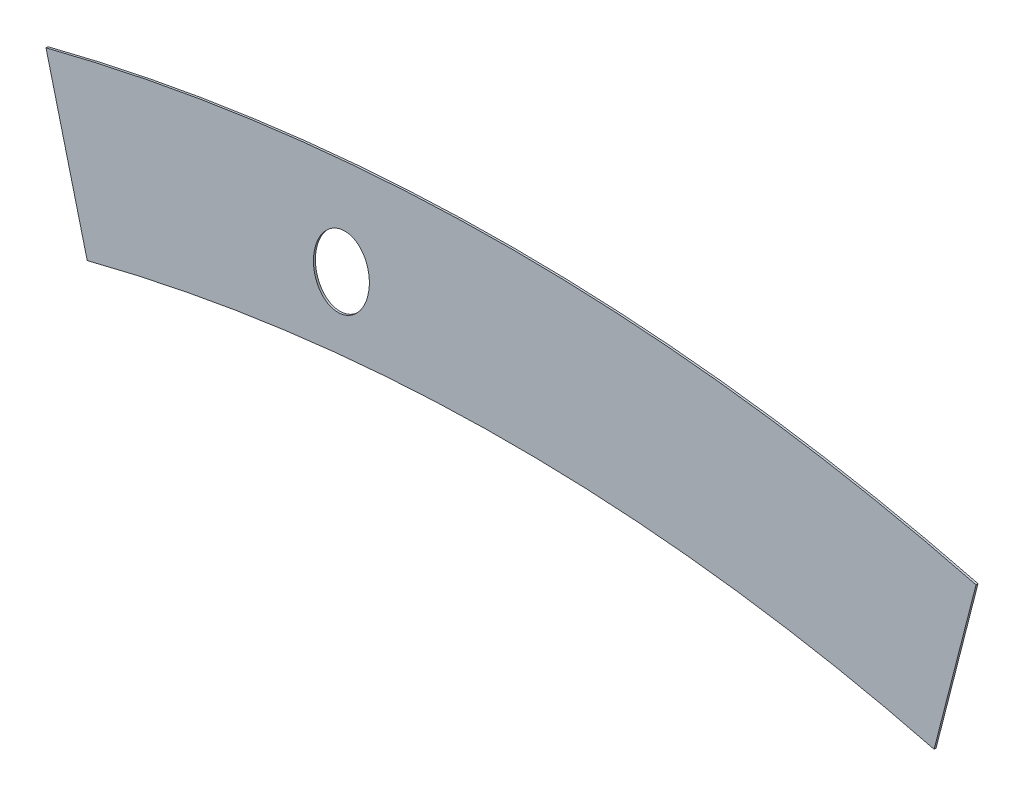
ISO-10303-21;
HEADER;
FILE_DESCRIPTION(('STEP AP214'),'2;1');
FILE_NAME('part.step','',(''),(''),'','','');
FILE_SCHEMA(('AUTOMOTIVE_DESIGN { 1 0 10303 214 1 1 1 1 }'));
ENDSEC;
DATA;
#1=APPLICATION_CONTEXT('core data for automotive mechanical design processes');
#2=APPLICATION_PROTOCOL_DEFINITION('international standard','automotive_design',2000,#1);
#3=PRODUCT_CONTEXT('',#1,'mechanical');
#4=PRODUCT('Part','Part','',(#3));
#5=PRODUCT_RELATED_PRODUCT_CATEGORY('part','',(#4));
#6=PRODUCT_DEFINITION_FORMATION('','',#4);
#7=PRODUCT_DEFINITION_CONTEXT('part definition',#1,'design');
#8=PRODUCT_DEFINITION('design','',#6,#7);
#9=PRODUCT_DEFINITION_SHAPE('','',#8);
#10=(LENGTH_UNIT() NAMED_UNIT(*) SI_UNIT(.MILLI.,.METRE.));
#11=(NAMED_UNIT(*) PLANE_ANGLE_UNIT() SI_UNIT($,.RADIAN.));
#12=(NAMED_UNIT(*) SI_UNIT($,.STERADIAN.) SOLID_ANGLE_UNIT());
#13=UNCERTAINTY_MEASURE_WITH_UNIT(LENGTH_MEASURE(1.E-05),#10,'distance_accuracy_value','');
#14=(GEOMETRIC_REPRESENTATION_CONTEXT(3) GLOBAL_UNCERTAINTY_ASSIGNED_CONTEXT((#13)) GLOBAL_UNIT_ASSIGNED_CONTEXT((#10,
#11,#12)) REPRESENTATION_CONTEXT('',''));
#15=CARTESIAN_POINT('',(0.,0.,0.));
#16=DIRECTION('',(0.,0.,1.));
#17=DIRECTION('',(1.,0.,0.));
#18=AXIS2_PLACEMENT_3D('',#15,#16,#17);
#19=CARTESIAN_POINT('',(9.27139000094597E-13,-3028.3658,-3.175));
#20=DIRECTION('',(0.,0.,1.));
#21=DIRECTION('',(1.,0.,0.));
#22=AXIS2_PLACEMENT_3D('',#19,#20,#21);
#23=CYLINDRICAL_SURFACE('',#22,3028.3658);
#24=CARTESIAN_POINT('',(9.27139000094597E-13,-3028.3658,0.));
#25=DIRECTION('',(0.,0.,1.));
#26=DIRECTION('',(1.,0.,0.));
#27=AXIS2_PLACEMENT_3D('',#24,#25,#26);
#28=CIRCLE('',#27,3028.3658);
#29=CARTESIAN_POINT('',(752.475,-94.9751350894021,0.));
#30=VERTEX_POINT('',#29);
#31=CARTESIAN_POINT('',(-752.475,-94.9751350894022,0.));
#32=VERTEX_POINT('',#31);
#33=EDGE_CURVE('E74',#30,#32,#28,.T.);
#34=ORIENTED_EDGE('',*,*,#33,.F.);
#35=DIRECTION('',(0.,0.,1.));
#36=VECTOR('',#35,1.);
#37=CARTESIAN_POINT('',(752.475,-94.9751350894021,-3.175));
#38=LINE('',#37,#36);
#39=CARTESIAN_POINT('',(752.475,-94.9751350894021,-3.175));
#40=VERTEX_POINT('',#39);
#41=EDGE_CURVE('E11',#40,#30,#38,.T.);
#42=ORIENTED_EDGE('',*,*,#41,.F.);
#43=CARTESIAN_POINT('',(9.27139000094597E-13,-3028.3658,-3.175));
#44=DIRECTION('',(0.,0.,1.));
#45=DIRECTION('',(1.,0.,0.));
#46=AXIS2_PLACEMENT_3D('',#43,#44,#45);
#47=CIRCLE('',#46,3028.3658);
#48=CARTESIAN_POINT('',(-752.475,-94.9751350894022,-3.175));
#49=VERTEX_POINT('',#48);
#50=EDGE_CURVE('E76',#40,#49,#47,.T.);
#51=ORIENTED_EDGE('',*,*,#50,.T.);
#52=DIRECTION('',(0.,0.,1.));
#53=VECTOR('',#52,1.);
#54=CARTESIAN_POINT('',(-752.475,-94.9751350894022,-3.175));
#55=LINE('',#54,#53);
#56=EDGE_CURVE('E37',#49,#32,#55,.T.);
#57=ORIENTED_EDGE('',*,*,#56,.T.);
#58=EDGE_LOOP('',(#34,#42,#51,#57));
#59=FACE_BOUND('',#58,.T.);
#60=ADVANCED_FACE('F34',(#59),#23,.T.);
#61=CARTESIAN_POINT('',(752.475,-94.9751350894021,-3.175));
#62=DIRECTION('',(0.968616978874542,-0.248558138542987,0.));
#63=DIRECTION('',(0.248558138542987,0.968616978874542,0.));
#64=AXIS2_PLACEMENT_3D('',#61,#62,#63);
#65=PLANE('',#64);
#66=DIRECTION('',(0.248558138542987,0.968616978874542,0.));
#67=VECTOR('',#66,1.);
#68=CARTESIAN_POINT('',(752.475,-94.9751350894021,0.));
#69=LINE('',#68,#67);
#70=CARTESIAN_POINT('',(684.6062,-359.456002226534,0.));
#71=VERTEX_POINT('',#70);
#72=EDGE_CURVE('E91',#71,#30,#69,.T.);
#73=ORIENTED_EDGE('',*,*,#72,.F.);
#74=DIRECTION('',(0.,0.,1.));
#75=VECTOR('',#74,1.);
#76=CARTESIAN_POINT('',(684.6062,-359.456002226534,-3.175));
#77=LINE('',#76,#75);
#78=CARTESIAN_POINT('',(684.6062,-359.456002226534,-3.175));
#79=VERTEX_POINT('',#78);
#80=EDGE_CURVE('E42',#79,#71,#77,.T.);
#81=ORIENTED_EDGE('',*,*,#80,.F.);
#82=DIRECTION('',(0.248558138542987,0.968616978874542,0.));
#83=VECTOR('',#82,1.);
#84=CARTESIAN_POINT('',(752.475,-94.9751350894021,-3.175));
#85=LINE('',#84,#83);
#86=EDGE_CURVE('E81',#79,#40,#85,.T.);
#87=ORIENTED_EDGE('',*,*,#86,.T.);
#88=ORIENTED_EDGE('',*,*,#41,.T.);
#89=EDGE_LOOP('',(#73,#81,#87,#88));
#90=FACE_BOUND('',#89,.T.);
#91=ADVANCED_FACE('F112',(#90),#65,.T.);
#92=CARTESIAN_POINT('',(9.27139000094597E-13,-3028.3658,-3.175));
#93=DIRECTION('',(0.,0.,1.));
#94=DIRECTION('',(1.,0.,0.));
#95=AXIS2_PLACEMENT_3D('',#92,#93,#94);
#96=CYLINDRICAL_SURFACE('',#95,2755.3158);
#97=CARTESIAN_POINT('',(9.27139000094597E-13,-3028.3658,0.));
#98=DIRECTION('',(0.,0.,-1.));
#99=DIRECTION('',(1.,0.,0.));
#100=AXIS2_PLACEMENT_3D('',#97,#98,#99);
#101=CIRCLE('',#100,2755.3158);
#102=CARTESIAN_POINT('',(-685.8,-359.762510312745,0.));
#103=VERTEX_POINT('',#102);
#104=EDGE_CURVE('E88',#103,#71,#101,.T.);
#105=ORIENTED_EDGE('',*,*,#104,.F.);
#106=DIRECTION('',(0.,0.,1.));
#107=VECTOR('',#106,1.);
#108=CARTESIAN_POINT('',(-685.8,-359.762510312745,-3.175));
#109=LINE('',#108,#107);
#110=CARTESIAN_POINT('',(-685.8,-359.762510312745,-3.175));
#111=VERTEX_POINT('',#110);
#112=EDGE_CURVE('E80',#111,#103,#109,.T.);
#113=ORIENTED_EDGE('',*,*,#112,.F.);
#114=CARTESIAN_POINT('',(9.27139000094597E-13,-3028.3658,-3.175));
#115=DIRECTION('',(0.,0.,-1.));
#116=DIRECTION('',(1.,0.,0.));
#117=AXIS2_PLACEMENT_3D('',#114,#115,#116);
#118=CIRCLE('',#117,2755.3158);
#119=EDGE_CURVE('E105',#111,#79,#118,.T.);
#120=ORIENTED_EDGE('',*,*,#119,.T.);
#121=ORIENTED_EDGE('',*,*,#80,.T.);
#122=EDGE_LOOP('',(#105,#113,#120,#121));
#123=FACE_BOUND('',#122,.T.);
#124=ADVANCED_FACE('F109',(#123),#96,.F.);
#125=CARTESIAN_POINT('',(-752.475,-94.9751350894022,-3.175));
#126=DIRECTION('',(-0.969729065270683,-0.244183414607234,0.));
#127=DIRECTION('',(0.244183414607234,-0.969729065270683,0.));
#128=AXIS2_PLACEMENT_3D('',#125,#126,#127);
#129=PLANE('',#128);
#130=DIRECTION('',(0.244183414607234,-0.969729065270683,0.));
#131=VECTOR('',#130,1.);
#132=CARTESIAN_POINT('',(-752.475,-94.9751350894022,0.));
#133=LINE('',#132,#131);
#134=EDGE_CURVE('E83',#32,#103,#133,.T.);
#135=ORIENTED_EDGE('',*,*,#134,.F.);
#136=ORIENTED_EDGE('',*,*,#56,.F.);
#137=DIRECTION('',(0.244183414607234,-0.969729065270683,0.));
#138=VECTOR('',#137,1.);
#139=CARTESIAN_POINT('',(-752.475,-94.9751350894022,-3.175));
#140=LINE('',#139,#138);
#141=EDGE_CURVE('E103',#49,#111,#140,.T.);
#142=ORIENTED_EDGE('',*,*,#141,.T.);
#143=ORIENTED_EDGE('',*,*,#112,.T.);
#144=EDGE_LOOP('',(#135,#136,#142,#143));
#145=FACE_BOUND('',#144,.T.);
#146=ADVANCED_FACE('F84',(#145),#129,.T.);
#147=CARTESIAN_POINT('',(9.27139000094597E-13,-3028.3658,-3.175));
#148=DIRECTION('',(0.,0.,1.));
#149=DIRECTION('',(1.,0.,0.));
#150=AXIS2_PLACEMENT_3D('',#147,#148,#149);
#151=PLANE('',#150);
#152=CARTESIAN_POINT('',(-274.458257631982,-169.743861590994,-3.175));
#153=DIRECTION('',(0.,0.,1.));
#154=DIRECTION('',(-0.202787295356513,-0.979222810621766,0.));
#155=AXIS2_PLACEMENT_3D('',#152,#153,#154);
#156=ELLIPSE('',#155,60.325,44.45);
#157=CARTESIAN_POINT('',(-286.691401224363,-228.815477641752,-3.175));
#158=VERTEX_POINT('',#157);
#159=EDGE_CURVE('E92',#158,#158,#156,.T.);
#160=ORIENTED_EDGE('',*,*,#159,.T.);
#161=EDGE_LOOP('',(#160));
#162=FACE_BOUND('',#161,.T.);
#163=ORIENTED_EDGE('',*,*,#50,.F.);
#164=ORIENTED_EDGE('',*,*,#86,.F.);
#165=ORIENTED_EDGE('',*,*,#119,.F.);
#166=ORIENTED_EDGE('',*,*,#141,.F.);
#167=EDGE_LOOP('',(#163,#164,#165,#166));
#168=FACE_BOUND('',#167,.T.);
#169=ADVANCED_FACE('F114',(#162,#168),#151,.F.);
#170=CARTESIAN_POINT('',(9.27139000094597E-13,-3028.3658,0.));
#171=DIRECTION('',(0.,0.,1.));
#172=DIRECTION('',(1.,0.,0.));
#173=AXIS2_PLACEMENT_3D('',#170,#171,#172);
#174=PLANE('',#173);
#175=CARTESIAN_POINT('',(-274.458257631982,-169.743861590994,0.));
#176=DIRECTION('',(0.,0.,1.));
#177=DIRECTION('',(-0.202787295356513,-0.979222810621766,0.));
#178=AXIS2_PLACEMENT_3D('',#175,#176,#177);
#179=ELLIPSE('',#178,60.325,44.45);
#180=CARTESIAN_POINT('',(-286.691401224363,-228.815477641752,0.));
#181=VERTEX_POINT('',#180);
#182=EDGE_CURVE('E95',#181,#181,#179,.T.);
#183=ORIENTED_EDGE('',*,*,#182,.F.);
#184=EDGE_LOOP('',(#183));
#185=FACE_BOUND('',#184,.T.);
#186=ORIENTED_EDGE('',*,*,#33,.T.);
#187=ORIENTED_EDGE('',*,*,#134,.T.);
#188=ORIENTED_EDGE('',*,*,#104,.T.);
#189=ORIENTED_EDGE('',*,*,#72,.T.);
#190=EDGE_LOOP('',(#186,#187,#188,#189));
#191=FACE_BOUND('',#190,.T.);
#192=ADVANCED_FACE('F90',(#185,#191),#174,.T.);
#193=DIRECTION('',(0.,0.,1.));
#194=VECTOR('',#193,1.);
#195=SURFACE_OF_LINEAR_EXTRUSION('',#156,#194);
#196=ORIENTED_EDGE('',*,*,#159,.F.);
#197=EDGE_LOOP('',(#196));
#198=FACE_BOUND('',#197,.T.);
#199=ORIENTED_EDGE('',*,*,#182,.T.);
#200=EDGE_LOOP('',(#199));
#201=FACE_BOUND('',#200,.T.);
#202=ADVANCED_FACE('F122',(#198,#201),#195,.F.);
#203=CLOSED_SHELL('',(#60,#91,#124,#146,#169,#192,#202));
#204=MANIFOLD_SOLID_BREP('B2',#203);
#205=ADVANCED_BREP_SHAPE_REPRESENTATION('',(#18,#204),#14);
#206=SHAPE_DEFINITION_REPRESENTATION(#9,#205);
ENDSEC;
END-ISO-10303-21;
